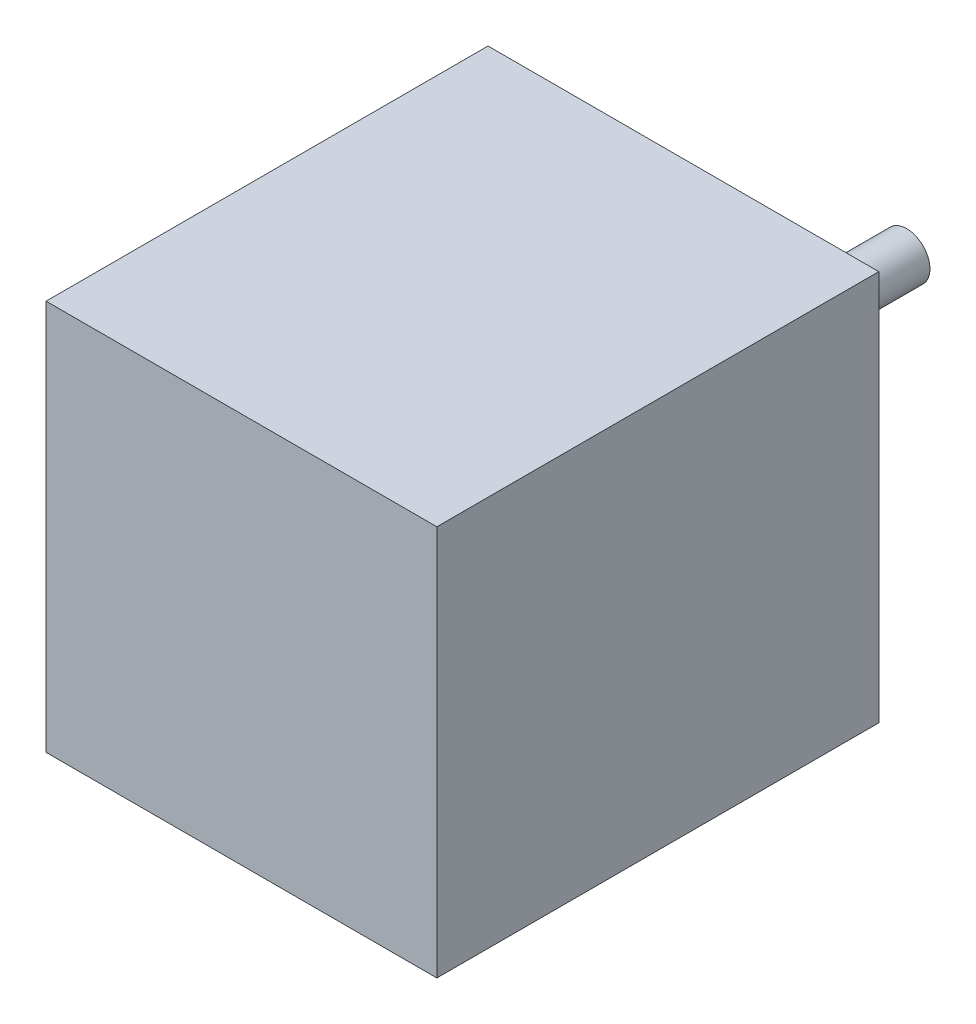
ISO-10303-21;
HEADER;
FILE_DESCRIPTION(('STEP AP214'),'2;1');
FILE_NAME('part.step','',(''),(''),'','','');
FILE_SCHEMA(('AUTOMOTIVE_DESIGN { 1 0 10303 214 1 1 1 1 }'));
ENDSEC;
DATA;
#1=APPLICATION_CONTEXT('core data for automotive mechanical design processes');
#2=APPLICATION_PROTOCOL_DEFINITION('international standard','automotive_design',2000,#1);
#3=PRODUCT_CONTEXT('',#1,'mechanical');
#4=PRODUCT('Part','Part','',(#3));
#5=PRODUCT_RELATED_PRODUCT_CATEGORY('part','',(#4));
#6=PRODUCT_DEFINITION_FORMATION('','',#4);
#7=PRODUCT_DEFINITION_CONTEXT('part definition',#1,'design');
#8=PRODUCT_DEFINITION('design','',#6,#7);
#9=PRODUCT_DEFINITION_SHAPE('','',#8);
#10=(LENGTH_UNIT() NAMED_UNIT(*) SI_UNIT(.MILLI.,.METRE.));
#11=(NAMED_UNIT(*) PLANE_ANGLE_UNIT() SI_UNIT($,.RADIAN.));
#12=(NAMED_UNIT(*) SI_UNIT($,.STERADIAN.) SOLID_ANGLE_UNIT());
#13=UNCERTAINTY_MEASURE_WITH_UNIT(LENGTH_MEASURE(1.E-05),#10,'distance_accuracy_value','');
#14=(GEOMETRIC_REPRESENTATION_CONTEXT(3) GLOBAL_UNCERTAINTY_ASSIGNED_CONTEXT((#13)) GLOBAL_UNIT_ASSIGNED_CONTEXT((#10,
#11,#12)) REPRESENTATION_CONTEXT('',''));
#15=CARTESIAN_POINT('',(0.,0.,0.));
#16=DIRECTION('',(0.,0.,1.));
#17=DIRECTION('',(1.,0.,0.));
#18=AXIS2_PLACEMENT_3D('',#15,#16,#17);
#19=CARTESIAN_POINT('',(0.,0.,47.5));
#20=DIRECTION('',(-1.,0.,0.));
#21=DIRECTION('',(0.,0.,1.));
#22=AXIS2_PLACEMENT_3D('',#19,#20,#21);
#23=PLANE('',#22);
#24=DIRECTION('',(0.,1.,0.));
#25=VECTOR('',#24,1.);
#26=CARTESIAN_POINT('',(0.,0.,0.));
#27=LINE('',#26,#25);
#28=CARTESIAN_POINT('',(0.,0.,0.));
#29=VERTEX_POINT('',#28);
#30=CARTESIAN_POINT('',(0.,42.,0.));
#31=VERTEX_POINT('',#30);
#32=EDGE_CURVE('E104',#29,#31,#27,.T.);
#33=ORIENTED_EDGE('',*,*,#32,.T.);
#34=DIRECTION('',(0.,0.,-1.));
#35=VECTOR('',#34,1.);
#36=CARTESIAN_POINT('',(0.,42.,47.5));
#37=LINE('',#36,#35);
#38=CARTESIAN_POINT('',(0.,42.,47.5));
#39=VERTEX_POINT('',#38);
#40=EDGE_CURVE('E40',#39,#31,#37,.T.);
#41=ORIENTED_EDGE('',*,*,#40,.F.);
#42=DIRECTION('',(0.,1.,0.));
#43=VECTOR('',#42,1.);
#44=CARTESIAN_POINT('',(0.,0.,47.5));
#45=LINE('',#44,#43);
#46=CARTESIAN_POINT('',(0.,0.,47.5));
#47=VERTEX_POINT('',#46);
#48=EDGE_CURVE('E91',#47,#39,#45,.T.);
#49=ORIENTED_EDGE('',*,*,#48,.F.);
#50=DIRECTION('',(0.,0.,-1.));
#51=VECTOR('',#50,1.);
#52=CARTESIAN_POINT('',(0.,0.,47.5));
#53=LINE('',#52,#51);
#54=EDGE_CURVE('E100',#47,#29,#53,.T.);
#55=ORIENTED_EDGE('',*,*,#54,.T.);
#56=EDGE_LOOP('',(#33,#41,#49,#55));
#57=FACE_BOUND('',#56,.T.);
#58=ADVANCED_FACE('F37',(#57),#23,.F.);
#59=CARTESIAN_POINT('',(0.,42.,47.5));
#60=DIRECTION('',(0.,-1.,0.));
#61=DIRECTION('',(1.,0.,0.));
#62=AXIS2_PLACEMENT_3D('',#59,#60,#61);
#63=PLANE('',#62);
#64=DIRECTION('',(-1.,0.,0.));
#65=VECTOR('',#64,1.);
#66=CARTESIAN_POINT('',(0.,42.,0.));
#67=LINE('',#66,#65);
#68=CARTESIAN_POINT('',(-42.,42.,0.));
#69=VERTEX_POINT('',#68);
#70=EDGE_CURVE('E96',#31,#69,#67,.T.);
#71=ORIENTED_EDGE('',*,*,#70,.T.);
#72=DIRECTION('',(0.,0.,-1.));
#73=VECTOR('',#72,1.);
#74=CARTESIAN_POINT('',(-42.,42.,47.5));
#75=LINE('',#74,#73);
#76=CARTESIAN_POINT('',(-42.,42.,47.5));
#77=VERTEX_POINT('',#76);
#78=EDGE_CURVE('E94',#77,#69,#75,.T.);
#79=ORIENTED_EDGE('',*,*,#78,.F.);
#80=DIRECTION('',(-1.,0.,0.));
#81=VECTOR('',#80,1.);
#82=CARTESIAN_POINT('',(0.,42.,47.5));
#83=LINE('',#82,#81);
#84=EDGE_CURVE('E86',#39,#77,#83,.T.);
#85=ORIENTED_EDGE('',*,*,#84,.F.);
#86=ORIENTED_EDGE('',*,*,#40,.T.);
#87=EDGE_LOOP('',(#71,#79,#85,#86));
#88=FACE_BOUND('',#87,.T.);
#89=ADVANCED_FACE('F95',(#88),#63,.F.);
#90=CARTESIAN_POINT('',(-42.,0.,47.5));
#91=DIRECTION('',(1.,0.,0.));
#92=DIRECTION('',(0.,0.,-1.));
#93=AXIS2_PLACEMENT_3D('',#90,#91,#92);
#94=PLANE('',#93);
#95=DIRECTION('',(0.,-1.,0.));
#96=VECTOR('',#95,1.);
#97=CARTESIAN_POINT('',(-42.,0.,0.));
#98=LINE('',#97,#96);
#99=CARTESIAN_POINT('',(-42.,0.,0.));
#100=VERTEX_POINT('',#99);
#101=EDGE_CURVE('E72',#69,#100,#98,.T.);
#102=ORIENTED_EDGE('',*,*,#101,.T.);
#103=DIRECTION('',(0.,0.,-1.));
#104=VECTOR('',#103,1.);
#105=CARTESIAN_POINT('',(-42.,0.,47.5));
#106=LINE('',#105,#104);
#107=CARTESIAN_POINT('',(-42.,0.,47.5));
#108=VERTEX_POINT('',#107);
#109=EDGE_CURVE('E97',#108,#100,#106,.T.);
#110=ORIENTED_EDGE('',*,*,#109,.F.);
#111=DIRECTION('',(0.,-1.,0.));
#112=VECTOR('',#111,1.);
#113=CARTESIAN_POINT('',(-42.,0.,47.5));
#114=LINE('',#113,#112);
#115=EDGE_CURVE('E89',#77,#108,#114,.T.);
#116=ORIENTED_EDGE('',*,*,#115,.F.);
#117=ORIENTED_EDGE('',*,*,#78,.T.);
#118=EDGE_LOOP('',(#102,#110,#116,#117));
#119=FACE_BOUND('',#118,.T.);
#120=ADVANCED_FACE('F98',(#119),#94,.F.);
#121=CARTESIAN_POINT('',(0.,0.,47.5));
#122=DIRECTION('',(0.,1.,0.));
#123=DIRECTION('',(-1.,0.,0.));
#124=AXIS2_PLACEMENT_3D('',#121,#122,#123);
#125=PLANE('',#124);
#126=DIRECTION('',(1.,0.,0.));
#127=VECTOR('',#126,1.);
#128=CARTESIAN_POINT('',(0.,0.,0.));
#129=LINE('',#128,#127);
#130=EDGE_CURVE('E78',#100,#29,#129,.T.);
#131=ORIENTED_EDGE('',*,*,#130,.T.);
#132=ORIENTED_EDGE('',*,*,#54,.F.);
#133=DIRECTION('',(1.,0.,0.));
#134=VECTOR('',#133,1.);
#135=CARTESIAN_POINT('',(0.,0.,47.5));
#136=LINE('',#135,#134);
#137=EDGE_CURVE('E55',#108,#47,#136,.T.);
#138=ORIENTED_EDGE('',*,*,#137,.F.);
#139=ORIENTED_EDGE('',*,*,#109,.T.);
#140=EDGE_LOOP('',(#131,#132,#138,#139));
#141=FACE_BOUND('',#140,.T.);
#142=ADVANCED_FACE('F112',(#141),#125,.F.);
#143=CARTESIAN_POINT('',(0.,0.,47.5));
#144=DIRECTION('',(0.,0.,1.));
#145=DIRECTION('',(1.,0.,0.));
#146=AXIS2_PLACEMENT_3D('',#143,#144,#145);
#147=PLANE('',#146);
#148=ORIENTED_EDGE('',*,*,#48,.T.);
#149=ORIENTED_EDGE('',*,*,#84,.T.);
#150=ORIENTED_EDGE('',*,*,#115,.T.);
#151=ORIENTED_EDGE('',*,*,#137,.T.);
#152=EDGE_LOOP('',(#148,#149,#150,#151));
#153=FACE_BOUND('',#152,.T.);
#154=ADVANCED_FACE('F87',(#153),#147,.T.);
#155=CARTESIAN_POINT('',(0.,0.,0.));
#156=DIRECTION('',(0.,0.,1.));
#157=DIRECTION('',(1.,0.,0.));
#158=AXIS2_PLACEMENT_3D('',#155,#156,#157);
#159=PLANE('',#158);
#160=CARTESIAN_POINT('',(-5.5,36.5,0.));
#161=DIRECTION('',(0.,0.,-1.));
#162=DIRECTION('',(-1.,0.,0.));
#163=AXIS2_PLACEMENT_3D('',#160,#161,#162);
#164=CIRCLE('',#163,1.5);
#165=CARTESIAN_POINT('',(-7.,36.5,0.));
#166=VERTEX_POINT('',#165);
#167=EDGE_CURVE('E132',#166,#166,#164,.T.);
#168=ORIENTED_EDGE('',*,*,#167,.F.);
#169=EDGE_LOOP('',(#168));
#170=FACE_BOUND('',#169,.T.);
#171=CARTESIAN_POINT('',(-36.5,36.5,0.));
#172=DIRECTION('',(0.,0.,-1.));
#173=DIRECTION('',(-1.,0.,0.));
#174=AXIS2_PLACEMENT_3D('',#171,#172,#173);
#175=CIRCLE('',#174,1.5);
#176=CARTESIAN_POINT('',(-38.,36.5,0.));
#177=VERTEX_POINT('',#176);
#178=EDGE_CURVE('E138',#177,#177,#175,.T.);
#179=ORIENTED_EDGE('',*,*,#178,.F.);
#180=EDGE_LOOP('',(#179));
#181=FACE_BOUND('',#180,.T.);
#182=CARTESIAN_POINT('',(-36.5,5.5,0.));
#183=DIRECTION('',(0.,0.,-1.));
#184=DIRECTION('',(-1.,0.,0.));
#185=AXIS2_PLACEMENT_3D('',#182,#183,#184);
#186=CIRCLE('',#185,1.5);
#187=CARTESIAN_POINT('',(-38.,5.5,0.));
#188=VERTEX_POINT('',#187);
#189=EDGE_CURVE('E144',#188,#188,#186,.T.);
#190=ORIENTED_EDGE('',*,*,#189,.F.);
#191=EDGE_LOOP('',(#190));
#192=FACE_BOUND('',#191,.T.);
#193=CARTESIAN_POINT('',(-5.5,5.5,0.));
#194=DIRECTION('',(0.,0.,-1.));
#195=DIRECTION('',(-1.,0.,0.));
#196=AXIS2_PLACEMENT_3D('',#193,#194,#195);
#197=CIRCLE('',#196,1.5);
#198=CARTESIAN_POINT('',(-7.,5.5,0.));
#199=VERTEX_POINT('',#198);
#200=EDGE_CURVE('E126',#199,#199,#197,.T.);
#201=ORIENTED_EDGE('',*,*,#200,.F.);
#202=EDGE_LOOP('',(#201));
#203=FACE_BOUND('',#202,.T.);
#204=CARTESIAN_POINT('',(-21.,21.,0.));
#205=DIRECTION('',(0.,0.,-1.));
#206=DIRECTION('',(-1.,0.,0.));
#207=AXIS2_PLACEMENT_3D('',#204,#205,#206);
#208=CIRCLE('',#207,11.);
#209=CARTESIAN_POINT('',(-32.,21.,0.));
#210=VERTEX_POINT('',#209);
#211=EDGE_CURVE('E46',#210,#210,#208,.T.);
#212=ORIENTED_EDGE('',*,*,#211,.F.);
#213=EDGE_LOOP('',(#212));
#214=FACE_BOUND('',#213,.T.);
#215=ORIENTED_EDGE('',*,*,#32,.F.);
#216=ORIENTED_EDGE('',*,*,#130,.F.);
#217=ORIENTED_EDGE('',*,*,#101,.F.);
#218=ORIENTED_EDGE('',*,*,#70,.F.);
#219=EDGE_LOOP('',(#215,#216,#217,#218));
#220=FACE_BOUND('',#219,.T.);
#221=ADVANCED_FACE('F115',(#170,#181,#192,#203,#214,#220),#159,.F.);
#222=CARTESIAN_POINT('',(-21.,21.,-2.));
#223=DIRECTION('',(0.,0.,1.));
#224=DIRECTION('',(1.,0.,0.));
#225=AXIS2_PLACEMENT_3D('',#222,#223,#224);
#226=CYLINDRICAL_SURFACE('',#225,11.);
#227=CARTESIAN_POINT('',(-21.,21.,-2.));
#228=DIRECTION('',(0.,0.,-1.));
#229=DIRECTION('',(-1.,0.,0.));
#230=AXIS2_PLACEMENT_3D('',#227,#228,#229);
#231=CIRCLE('',#230,11.);
#232=CARTESIAN_POINT('',(-32.,21.,-2.));
#233=VERTEX_POINT('',#232);
#234=EDGE_CURVE('E107',#233,#233,#231,.T.);
#235=ORIENTED_EDGE('',*,*,#234,.F.);
#236=EDGE_LOOP('',(#235));
#237=FACE_BOUND('',#236,.T.);
#238=ORIENTED_EDGE('',*,*,#211,.T.);
#239=EDGE_LOOP('',(#238));
#240=FACE_BOUND('',#239,.T.);
#241=ADVANCED_FACE('F161',(#237,#240),#226,.T.);
#242=CARTESIAN_POINT('',(-21.,21.,-2.));
#243=DIRECTION('',(0.,0.,-1.));
#244=DIRECTION('',(-1.,0.,0.));
#245=AXIS2_PLACEMENT_3D('',#242,#243,#244);
#246=PLANE('',#245);
#247=CARTESIAN_POINT('',(-21.,21.,-2.));
#248=DIRECTION('',(0.,0.,-1.));
#249=DIRECTION('',(-1.,0.,0.));
#250=AXIS2_PLACEMENT_3D('',#247,#248,#249);
#251=CIRCLE('',#250,2.5);
#252=CARTESIAN_POINT('',(-23.5,21.,-2.));
#253=VERTEX_POINT('',#252);
#254=EDGE_CURVE('E11',#253,#253,#251,.T.);
#255=ORIENTED_EDGE('',*,*,#254,.F.);
#256=EDGE_LOOP('',(#255));
#257=FACE_BOUND('',#256,.T.);
#258=ORIENTED_EDGE('',*,*,#234,.T.);
#259=EDGE_LOOP('',(#258));
#260=FACE_BOUND('',#259,.T.);
#261=ADVANCED_FACE('F169',(#257,#260),#246,.T.);
#262=CARTESIAN_POINT('',(-21.,21.,-24.));
#263=DIRECTION('',(0.,0.,1.));
#264=DIRECTION('',(1.,0.,0.));
#265=AXIS2_PLACEMENT_3D('',#262,#263,#264);
#266=CYLINDRICAL_SURFACE('',#265,2.5);
#267=CARTESIAN_POINT('',(-21.,21.,-24.));
#268=DIRECTION('',(0.,0.,-1.));
#269=DIRECTION('',(-1.,0.,0.));
#270=AXIS2_PLACEMENT_3D('',#267,#268,#269);
#271=CIRCLE('',#270,2.5);
#272=CARTESIAN_POINT('',(-23.5,21.,-24.));
#273=VERTEX_POINT('',#272);
#274=EDGE_CURVE('E121',#273,#273,#271,.T.);
#275=ORIENTED_EDGE('',*,*,#274,.F.);
#276=EDGE_LOOP('',(#275));
#277=FACE_BOUND('',#276,.T.);
#278=ORIENTED_EDGE('',*,*,#254,.T.);
#279=EDGE_LOOP('',(#278));
#280=FACE_BOUND('',#279,.T.);
#281=ADVANCED_FACE('F175',(#277,#280),#266,.T.);
#282=CARTESIAN_POINT('',(-21.,21.,-24.));
#283=DIRECTION('',(0.,0.,-1.));
#284=DIRECTION('',(-1.,0.,0.));
#285=AXIS2_PLACEMENT_3D('',#282,#283,#284);
#286=PLANE('',#285);
#287=ORIENTED_EDGE('',*,*,#274,.T.);
#288=EDGE_LOOP('',(#287));
#289=FACE_BOUND('',#288,.T.);
#290=ADVANCED_FACE('F206',(#289),#286,.T.);
#291=CARTESIAN_POINT('',(-5.5,5.5,8.));
#292=DIRECTION('',(0.,0.,-1.));
#293=DIRECTION('',(-1.,0.,0.));
#294=AXIS2_PLACEMENT_3D('',#291,#292,#293);
#295=CYLINDRICAL_SURFACE('',#294,1.5);
#296=CARTESIAN_POINT('',(-5.5,5.5,8.));
#297=DIRECTION('',(0.,0.,-1.));
#298=DIRECTION('',(-1.,0.,0.));
#299=AXIS2_PLACEMENT_3D('',#296,#297,#298);
#300=CIRCLE('',#299,1.5);
#301=CARTESIAN_POINT('',(-7.,5.5,8.));
#302=VERTEX_POINT('',#301);
#303=EDGE_CURVE('E125',#302,#302,#300,.T.);
#304=ORIENTED_EDGE('',*,*,#303,.F.);
#305=EDGE_LOOP('',(#304));
#306=FACE_BOUND('',#305,.T.);
#307=ORIENTED_EDGE('',*,*,#200,.T.);
#308=EDGE_LOOP('',(#307));
#309=FACE_BOUND('',#308,.T.);
#310=ADVANCED_FACE('F211',(#306,#309),#295,.F.);
#311=CARTESIAN_POINT('',(-5.5,5.5,8.));
#312=DIRECTION('',(0.,0.,-1.));
#313=DIRECTION('',(-1.,0.,0.));
#314=AXIS2_PLACEMENT_3D('',#311,#312,#313);
#315=PLANE('',#314);
#316=ORIENTED_EDGE('',*,*,#303,.T.);
#317=EDGE_LOOP('',(#316));
#318=FACE_BOUND('',#317,.T.);
#319=ADVANCED_FACE('F155',(#318),#315,.T.);
#320=CARTESIAN_POINT('',(-36.5,5.5,8.));
#321=DIRECTION('',(0.,0.,-1.));
#322=DIRECTION('',(-1.,0.,0.));
#323=AXIS2_PLACEMENT_3D('',#320,#321,#322);
#324=CYLINDRICAL_SURFACE('',#323,1.5);
#325=CARTESIAN_POINT('',(-36.5,5.5,8.));
#326=DIRECTION('',(0.,0.,-1.));
#327=DIRECTION('',(-1.,0.,0.));
#328=AXIS2_PLACEMENT_3D('',#325,#326,#327);
#329=CIRCLE('',#328,1.5);
#330=CARTESIAN_POINT('',(-38.,5.5,8.));
#331=VERTEX_POINT('',#330);
#332=EDGE_CURVE('E129',#331,#331,#329,.T.);
#333=ORIENTED_EDGE('',*,*,#332,.F.);
#334=EDGE_LOOP('',(#333));
#335=FACE_BOUND('',#334,.T.);
#336=ORIENTED_EDGE('',*,*,#189,.T.);
#337=EDGE_LOOP('',(#336));
#338=FACE_BOUND('',#337,.T.);
#339=ADVANCED_FACE('F152',(#335,#338),#324,.F.);
#340=CARTESIAN_POINT('',(-36.5,5.5,8.));
#341=DIRECTION('',(0.,0.,-1.));
#342=DIRECTION('',(-1.,0.,0.));
#343=AXIS2_PLACEMENT_3D('',#340,#341,#342);
#344=PLANE('',#343);
#345=ORIENTED_EDGE('',*,*,#332,.T.);
#346=EDGE_LOOP('',(#345));
#347=FACE_BOUND('',#346,.T.);
#348=ADVANCED_FACE('F150',(#347),#344,.T.);
#349=CARTESIAN_POINT('',(-36.5,36.5,8.));
#350=DIRECTION('',(0.,0.,-1.));
#351=DIRECTION('',(-1.,0.,0.));
#352=AXIS2_PLACEMENT_3D('',#349,#350,#351);
#353=CYLINDRICAL_SURFACE('',#352,1.5);
#354=CARTESIAN_POINT('',(-36.5,36.5,8.));
#355=DIRECTION('',(0.,0.,-1.));
#356=DIRECTION('',(-1.,0.,0.));
#357=AXIS2_PLACEMENT_3D('',#354,#355,#356);
#358=CIRCLE('',#357,1.5);
#359=CARTESIAN_POINT('',(-38.,36.5,8.));
#360=VERTEX_POINT('',#359);
#361=EDGE_CURVE('E141',#360,#360,#358,.T.);
#362=ORIENTED_EDGE('',*,*,#361,.F.);
#363=EDGE_LOOP('',(#362));
#364=FACE_BOUND('',#363,.T.);
#365=ORIENTED_EDGE('',*,*,#178,.T.);
#366=EDGE_LOOP('',(#365));
#367=FACE_BOUND('',#366,.T.);
#368=ADVANCED_FACE('F240',(#364,#367),#353,.F.);
#369=CARTESIAN_POINT('',(-36.5,36.5,8.));
#370=DIRECTION('',(0.,0.,-1.));
#371=DIRECTION('',(-1.,0.,0.));
#372=AXIS2_PLACEMENT_3D('',#369,#370,#371);
#373=PLANE('',#372);
#374=ORIENTED_EDGE('',*,*,#361,.T.);
#375=EDGE_LOOP('',(#374));
#376=FACE_BOUND('',#375,.T.);
#377=ADVANCED_FACE('F249',(#376),#373,.T.);
#378=CARTESIAN_POINT('',(-5.5,36.5,8.));
#379=DIRECTION('',(0.,0.,-1.));
#380=DIRECTION('',(-1.,0.,0.));
#381=AXIS2_PLACEMENT_3D('',#378,#379,#380);
#382=CYLINDRICAL_SURFACE('',#381,1.5);
#383=CARTESIAN_POINT('',(-5.5,36.5,8.));
#384=DIRECTION('',(0.,0.,-1.));
#385=DIRECTION('',(-1.,0.,0.));
#386=AXIS2_PLACEMENT_3D('',#383,#384,#385);
#387=CIRCLE('',#386,1.5);
#388=CARTESIAN_POINT('',(-7.,36.5,8.));
#389=VERTEX_POINT('',#388);
#390=EDGE_CURVE('E135',#389,#389,#387,.T.);
#391=ORIENTED_EDGE('',*,*,#390,.F.);
#392=EDGE_LOOP('',(#391));
#393=FACE_BOUND('',#392,.T.);
#394=ORIENTED_EDGE('',*,*,#167,.T.);
#395=EDGE_LOOP('',(#394));
#396=FACE_BOUND('',#395,.T.);
#397=ADVANCED_FACE('F259',(#393,#396),#382,.F.);
#398=CARTESIAN_POINT('',(-5.5,36.5,8.));
#399=DIRECTION('',(0.,0.,-1.));
#400=DIRECTION('',(-1.,0.,0.));
#401=AXIS2_PLACEMENT_3D('',#398,#399,#400);
#402=PLANE('',#401);
#403=ORIENTED_EDGE('',*,*,#390,.T.);
#404=EDGE_LOOP('',(#403));
#405=FACE_BOUND('',#404,.T.);
#406=ADVANCED_FACE('F269',(#405),#402,.T.);
#407=CLOSED_SHELL('',(#58,#89,#120,#142,#154,#221,#241,#261,#281,#290,#310,#319,#339,#348,#368,
#377,#397,#406));
#408=MANIFOLD_SOLID_BREP('B2',#407);
#409=ADVANCED_BREP_SHAPE_REPRESENTATION('',(#18,#408),#14);
#410=SHAPE_DEFINITION_REPRESENTATION(#9,#409);
ENDSEC;
END-ISO-10303-21;
